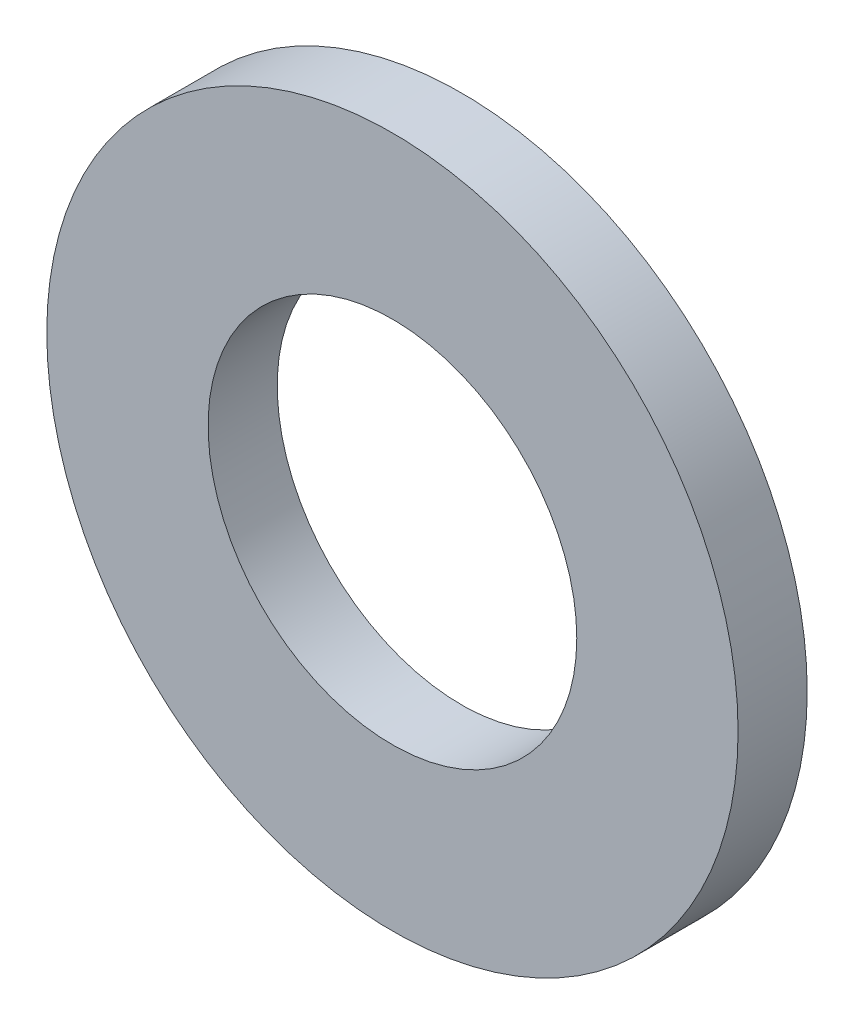
ISO-10303-21;
HEADER;
FILE_DESCRIPTION(('STEP AP214'),'2;1');
FILE_NAME('part.step','',(''),(''),'','','');
FILE_SCHEMA(('AUTOMOTIVE_DESIGN { 1 0 10303 214 1 1 1 1 }'));
ENDSEC;
DATA;
#1=APPLICATION_CONTEXT('core data for automotive mechanical design processes');
#2=APPLICATION_PROTOCOL_DEFINITION('international standard','automotive_design',2000,#1);
#3=PRODUCT_CONTEXT('',#1,'mechanical');
#4=PRODUCT('Part','Part','',(#3));
#5=PRODUCT_RELATED_PRODUCT_CATEGORY('part','',(#4));
#6=PRODUCT_DEFINITION_FORMATION('','',#4);
#7=PRODUCT_DEFINITION_CONTEXT('part definition',#1,'design');
#8=PRODUCT_DEFINITION('design','',#6,#7);
#9=PRODUCT_DEFINITION_SHAPE('','',#8);
#10=(LENGTH_UNIT() NAMED_UNIT(*) SI_UNIT(.MILLI.,.METRE.));
#11=(NAMED_UNIT(*) PLANE_ANGLE_UNIT() SI_UNIT($,.RADIAN.));
#12=(NAMED_UNIT(*) SI_UNIT($,.STERADIAN.) SOLID_ANGLE_UNIT());
#13=UNCERTAINTY_MEASURE_WITH_UNIT(LENGTH_MEASURE(1.E-05),#10,'distance_accuracy_value','');
#14=(GEOMETRIC_REPRESENTATION_CONTEXT(3) GLOBAL_UNCERTAINTY_ASSIGNED_CONTEXT((#13)) GLOBAL_UNIT_ASSIGNED_CONTEXT((#10,
#11,#12)) REPRESENTATION_CONTEXT('',''));
#15=CARTESIAN_POINT('',(0.,0.,0.));
#16=DIRECTION('',(0.,0.,1.));
#17=DIRECTION('',(1.,0.,0.));
#18=AXIS2_PLACEMENT_3D('',#15,#16,#17);
#19=CARTESIAN_POINT('',(0.,0.,0.75));
#20=DIRECTION('',(0.,0.,1.));
#21=DIRECTION('',(1.,0.,0.));
#22=AXIS2_PLACEMENT_3D('',#19,#20,#21);
#23=PLANE('',#22);
#24=CARTESIAN_POINT('',(0.,0.,0.75));
#25=DIRECTION('',(0.,0.,1.));
#26=DIRECTION('',(1.,0.,0.));
#27=AXIS2_PLACEMENT_3D('',#24,#25,#26);
#28=CIRCLE('',#27,7.5);
#29=CARTESIAN_POINT('',(7.5,0.,0.75));
#30=VERTEX_POINT('',#29);
#31=EDGE_CURVE('E10',#30,#30,#28,.T.);
#32=ORIENTED_EDGE('',*,*,#31,.T.);
#33=EDGE_LOOP('',(#32));
#34=FACE_BOUND('',#33,.T.);
#35=CARTESIAN_POINT('',(0.,0.,0.75));
#36=DIRECTION('',(0.,0.,1.));
#37=DIRECTION('',(1.,0.,0.));
#38=AXIS2_PLACEMENT_3D('',#35,#36,#37);
#39=CIRCLE('',#38,4.);
#40=CARTESIAN_POINT('',(4.,0.,0.75));
#41=VERTEX_POINT('',#40);
#42=EDGE_CURVE('E46',#41,#41,#39,.T.);
#43=ORIENTED_EDGE('',*,*,#42,.F.);
#44=EDGE_LOOP('',(#43));
#45=FACE_BOUND('',#44,.T.);
#46=ADVANCED_FACE('F35',(#34,#45),#23,.T.);
#47=CARTESIAN_POINT('',(0.,0.,-0.75));
#48=DIRECTION('',(0.,0.,1.));
#49=DIRECTION('',(1.,0.,0.));
#50=AXIS2_PLACEMENT_3D('',#47,#48,#49);
#51=PLANE('',#50);
#52=CARTESIAN_POINT('',(0.,0.,-0.75));
#53=DIRECTION('',(0.,0.,1.));
#54=DIRECTION('',(1.,0.,0.));
#55=AXIS2_PLACEMENT_3D('',#52,#53,#54);
#56=CIRCLE('',#55,7.5);
#57=CARTESIAN_POINT('',(7.5,0.,-0.75));
#58=VERTEX_POINT('',#57);
#59=EDGE_CURVE('E39',#58,#58,#56,.T.);
#60=ORIENTED_EDGE('',*,*,#59,.F.);
#61=EDGE_LOOP('',(#60));
#62=FACE_BOUND('',#61,.T.);
#63=CARTESIAN_POINT('',(0.,0.,-0.75));
#64=DIRECTION('',(0.,0.,1.));
#65=DIRECTION('',(1.,0.,0.));
#66=AXIS2_PLACEMENT_3D('',#63,#64,#65);
#67=CIRCLE('',#66,4.);
#68=CARTESIAN_POINT('',(4.,0.,-0.75));
#69=VERTEX_POINT('',#68);
#70=EDGE_CURVE('E48',#69,#69,#67,.T.);
#71=ORIENTED_EDGE('',*,*,#70,.T.);
#72=EDGE_LOOP('',(#71));
#73=FACE_BOUND('',#72,.T.);
#74=ADVANCED_FACE('F58',(#62,#73),#51,.F.);
#75=CARTESIAN_POINT('',(0.,0.,0.75));
#76=DIRECTION('',(0.,0.,-1.));
#77=DIRECTION('',(-1.,0.,0.));
#78=AXIS2_PLACEMENT_3D('',#75,#76,#77);
#79=CYLINDRICAL_SURFACE('',#78,7.5);
#80=ORIENTED_EDGE('',*,*,#31,.F.);
#81=EDGE_LOOP('',(#80));
#82=FACE_BOUND('',#81,.T.);
#83=ORIENTED_EDGE('',*,*,#59,.T.);
#84=EDGE_LOOP('',(#83));
#85=FACE_BOUND('',#84,.T.);
#86=ADVANCED_FACE('F37',(#82,#85),#79,.T.);
#87=CARTESIAN_POINT('',(0.,0.,0.75));
#88=DIRECTION('',(0.,0.,-1.));
#89=DIRECTION('',(-1.,0.,0.));
#90=AXIS2_PLACEMENT_3D('',#87,#88,#89);
#91=CYLINDRICAL_SURFACE('',#90,4.);
#92=ORIENTED_EDGE('',*,*,#42,.T.);
#93=EDGE_LOOP('',(#92));
#94=FACE_BOUND('',#93,.T.);
#95=ORIENTED_EDGE('',*,*,#70,.F.);
#96=EDGE_LOOP('',(#95));
#97=FACE_BOUND('',#96,.T.);
#98=ADVANCED_FACE('F54',(#94,#97),#91,.F.);
#99=CLOSED_SHELL('',(#46,#74,#86,#98));
#100=MANIFOLD_SOLID_BREP('B2',#99);
#101=ADVANCED_BREP_SHAPE_REPRESENTATION('',(#18,#100),#14);
#102=SHAPE_DEFINITION_REPRESENTATION(#9,#101);
ENDSEC;
END-ISO-10303-21;
